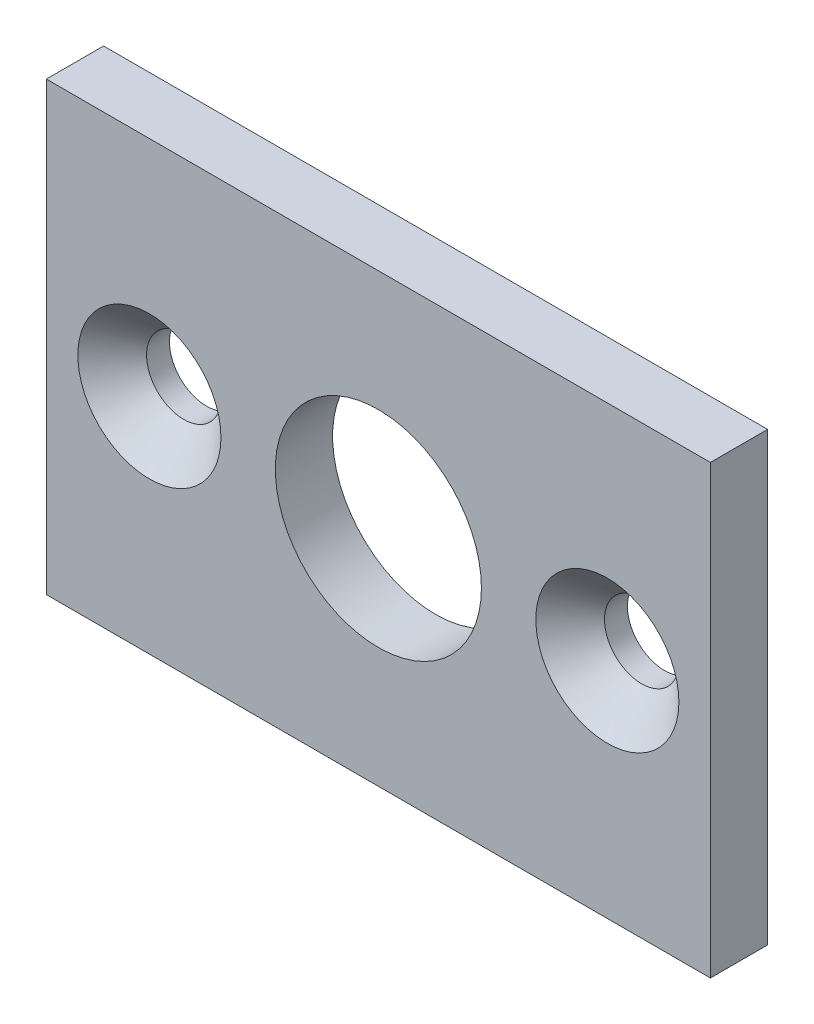
ISO-10303-21;
HEADER;
FILE_DESCRIPTION(('STEP AP214'),'2;1');
FILE_NAME('part.step','',(''),(''),'','','');
FILE_SCHEMA(('AUTOMOTIVE_DESIGN { 1 0 10303 214 1 1 1 1 }'));
ENDSEC;
DATA;
#1=APPLICATION_CONTEXT('core data for automotive mechanical design processes');
#2=APPLICATION_PROTOCOL_DEFINITION('international standard','automotive_design',2000,#1);
#3=PRODUCT_CONTEXT('',#1,'mechanical');
#4=PRODUCT('Part','Part','',(#3));
#5=PRODUCT_RELATED_PRODUCT_CATEGORY('part','',(#4));
#6=PRODUCT_DEFINITION_FORMATION('','',#4);
#7=PRODUCT_DEFINITION_CONTEXT('part definition',#1,'design');
#8=PRODUCT_DEFINITION('design','',#6,#7);
#9=PRODUCT_DEFINITION_SHAPE('','',#8);
#10=(LENGTH_UNIT() NAMED_UNIT(*) SI_UNIT(.MILLI.,.METRE.));
#11=(NAMED_UNIT(*) PLANE_ANGLE_UNIT() SI_UNIT($,.RADIAN.));
#12=(NAMED_UNIT(*) SI_UNIT($,.STERADIAN.) SOLID_ANGLE_UNIT());
#13=UNCERTAINTY_MEASURE_WITH_UNIT(LENGTH_MEASURE(1.E-05),#10,'distance_accuracy_value','');
#14=(GEOMETRIC_REPRESENTATION_CONTEXT(3) GLOBAL_UNCERTAINTY_ASSIGNED_CONTEXT((#13)) GLOBAL_UNIT_ASSIGNED_CONTEXT((#10,
#11,#12)) REPRESENTATION_CONTEXT('',''));
#15=CARTESIAN_POINT('',(0.,0.,0.));
#16=DIRECTION('',(0.,0.,1.));
#17=DIRECTION('',(1.,0.,0.));
#18=AXIS2_PLACEMENT_3D('',#15,#16,#17);
#19=CARTESIAN_POINT('',(0.,0.,5.));
#20=DIRECTION('',(0.,0.,1.));
#21=DIRECTION('',(1.,0.,0.));
#22=AXIS2_PLACEMENT_3D('',#19,#20,#21);
#23=PLANE('',#22);
#24=CARTESIAN_POINT('',(-20.,0.,5.));
#25=DIRECTION('',(0.,0.,1.));
#26=DIRECTION('',(1.,0.,0.));
#27=AXIS2_PLACEMENT_3D('',#24,#25,#26);
#28=CIRCLE('',#27,6.25);
#29=CARTESIAN_POINT('',(-13.75,0.,5.));
#30=VERTEX_POINT('',#29);
#31=EDGE_CURVE('E133',#30,#30,#28,.T.);
#32=ORIENTED_EDGE('',*,*,#31,.F.);
#33=EDGE_LOOP('',(#32));
#34=FACE_BOUND('',#33,.T.);
#35=CARTESIAN_POINT('',(20.,0.,5.));
#36=DIRECTION('',(0.,0.,1.));
#37=DIRECTION('',(1.,0.,0.));
#38=AXIS2_PLACEMENT_3D('',#35,#36,#37);
#39=CIRCLE('',#38,6.25);
#40=CARTESIAN_POINT('',(26.25,0.,5.));
#41=VERTEX_POINT('',#40);
#42=EDGE_CURVE('E124',#41,#41,#39,.T.);
#43=ORIENTED_EDGE('',*,*,#42,.F.);
#44=EDGE_LOOP('',(#43));
#45=FACE_BOUND('',#44,.T.);
#46=DIRECTION('',(0.,1.,0.));
#47=VECTOR('',#46,1.);
#48=CARTESIAN_POINT('',(29.,19.5,5.));
#49=LINE('',#48,#47);
#50=CARTESIAN_POINT('',(29.,-19.5,5.));
#51=VERTEX_POINT('',#50);
#52=CARTESIAN_POINT('',(29.,19.5,5.));
#53=VERTEX_POINT('',#52);
#54=EDGE_CURVE('E86',#51,#53,#49,.T.);
#55=ORIENTED_EDGE('',*,*,#54,.T.);
#56=DIRECTION('',(-1.,0.,0.));
#57=VECTOR('',#56,1.);
#58=CARTESIAN_POINT('',(-29.,19.5,5.));
#59=LINE('',#58,#57);
#60=CARTESIAN_POINT('',(-29.,19.5,5.));
#61=VERTEX_POINT('',#60);
#62=EDGE_CURVE('E81',#53,#61,#59,.T.);
#63=ORIENTED_EDGE('',*,*,#62,.T.);
#64=DIRECTION('',(0.,-1.,0.));
#65=VECTOR('',#64,1.);
#66=CARTESIAN_POINT('',(-29.,19.5,5.));
#67=LINE('',#66,#65);
#68=CARTESIAN_POINT('',(-29.,-19.5,5.));
#69=VERTEX_POINT('',#68);
#70=EDGE_CURVE('E84',#61,#69,#67,.T.);
#71=ORIENTED_EDGE('',*,*,#70,.T.);
#72=DIRECTION('',(1.,0.,0.));
#73=VECTOR('',#72,1.);
#74=CARTESIAN_POINT('',(-29.,-19.5,5.));
#75=LINE('',#74,#73);
#76=EDGE_CURVE('E51',#69,#51,#75,.T.);
#77=ORIENTED_EDGE('',*,*,#76,.T.);
#78=EDGE_LOOP('',(#55,#63,#71,#77));
#79=FACE_BOUND('',#78,.T.);
#80=CARTESIAN_POINT('',(0.,0.,5.));
#81=DIRECTION('',(0.,0.,1.));
#82=DIRECTION('',(1.,0.,0.));
#83=AXIS2_PLACEMENT_3D('',#80,#81,#82);
#84=CIRCLE('',#83,9.);
#85=CARTESIAN_POINT('',(9.00000000000001,0.,5.));
#86=VERTEX_POINT('',#85);
#87=EDGE_CURVE('E101',#86,#86,#84,.T.);
#88=ORIENTED_EDGE('',*,*,#87,.F.);
#89=EDGE_LOOP('',(#88));
#90=FACE_BOUND('',#89,.T.);
#91=ADVANCED_FACE('F34',(#34,#45,#79,#90),#23,.T.);
#92=CARTESIAN_POINT('',(0.,0.,0.));
#93=DIRECTION('',(0.,0.,1.));
#94=DIRECTION('',(1.,0.,0.));
#95=AXIS2_PLACEMENT_3D('',#92,#93,#94);
#96=PLANE('',#95);
#97=CARTESIAN_POINT('',(-20.,0.,0.));
#98=DIRECTION('',(0.,0.,1.));
#99=DIRECTION('',(1.,0.,0.));
#100=AXIS2_PLACEMENT_3D('',#97,#98,#99);
#101=CIRCLE('',#100,3.24999999999999);
#102=CARTESIAN_POINT('',(-16.75,0.,0.));
#103=VERTEX_POINT('',#102);
#104=EDGE_CURVE('E130',#103,#103,#101,.T.);
#105=ORIENTED_EDGE('',*,*,#104,.T.);
#106=EDGE_LOOP('',(#105));
#107=FACE_BOUND('',#106,.T.);
#108=CARTESIAN_POINT('',(20.,0.,0.));
#109=DIRECTION('',(0.,0.,1.));
#110=DIRECTION('',(1.,0.,0.));
#111=AXIS2_PLACEMENT_3D('',#108,#109,#110);
#112=CIRCLE('',#111,3.24999999999999);
#113=CARTESIAN_POINT('',(23.25,0.,0.));
#114=VERTEX_POINT('',#113);
#115=EDGE_CURVE('E116',#114,#114,#112,.T.);
#116=ORIENTED_EDGE('',*,*,#115,.T.);
#117=EDGE_LOOP('',(#116));
#118=FACE_BOUND('',#117,.T.);
#119=DIRECTION('',(0.,1.,0.));
#120=VECTOR('',#119,1.);
#121=CARTESIAN_POINT('',(29.,19.5,0.));
#122=LINE('',#121,#120);
#123=CARTESIAN_POINT('',(29.,-19.5,0.));
#124=VERTEX_POINT('',#123);
#125=CARTESIAN_POINT('',(29.,19.5,0.));
#126=VERTEX_POINT('',#125);
#127=EDGE_CURVE('E98',#124,#126,#122,.T.);
#128=ORIENTED_EDGE('',*,*,#127,.F.);
#129=DIRECTION('',(1.,0.,0.));
#130=VECTOR('',#129,1.);
#131=CARTESIAN_POINT('',(-29.,-19.5,0.));
#132=LINE('',#131,#130);
#133=CARTESIAN_POINT('',(-29.,-19.5,0.));
#134=VERTEX_POINT('',#133);
#135=EDGE_CURVE('E74',#134,#124,#132,.T.);
#136=ORIENTED_EDGE('',*,*,#135,.F.);
#137=DIRECTION('',(0.,-1.,0.));
#138=VECTOR('',#137,1.);
#139=CARTESIAN_POINT('',(-29.,19.5,0.));
#140=LINE('',#139,#138);
#141=CARTESIAN_POINT('',(-29.,19.5,0.));
#142=VERTEX_POINT('',#141);
#143=EDGE_CURVE('E68',#142,#134,#140,.T.);
#144=ORIENTED_EDGE('',*,*,#143,.F.);
#145=DIRECTION('',(-1.,0.,0.));
#146=VECTOR('',#145,1.);
#147=CARTESIAN_POINT('',(-29.,19.5,0.));
#148=LINE('',#147,#146);
#149=EDGE_CURVE('E90',#126,#142,#148,.T.);
#150=ORIENTED_EDGE('',*,*,#149,.F.);
#151=EDGE_LOOP('',(#128,#136,#144,#150));
#152=FACE_BOUND('',#151,.T.);
#153=CARTESIAN_POINT('',(0.,0.,0.));
#154=DIRECTION('',(0.,0.,1.));
#155=DIRECTION('',(1.,0.,0.));
#156=AXIS2_PLACEMENT_3D('',#153,#154,#155);
#157=CIRCLE('',#156,9.);
#158=CARTESIAN_POINT('',(9.00000000000001,0.,0.));
#159=VERTEX_POINT('',#158);
#160=EDGE_CURVE('E113',#159,#159,#157,.T.);
#161=ORIENTED_EDGE('',*,*,#160,.T.);
#162=EDGE_LOOP('',(#161));
#163=FACE_BOUND('',#162,.T.);
#164=ADVANCED_FACE('F109',(#107,#118,#152,#163),#96,.F.);
#165=CARTESIAN_POINT('',(29.,19.5,5.));
#166=DIRECTION('',(-1.,0.,0.));
#167=DIRECTION('',(0.,-1.,0.));
#168=AXIS2_PLACEMENT_3D('',#165,#166,#167);
#169=PLANE('',#168);
#170=ORIENTED_EDGE('',*,*,#127,.T.);
#171=DIRECTION('',(0.,0.,-1.));
#172=VECTOR('',#171,1.);
#173=CARTESIAN_POINT('',(29.,19.5,5.));
#174=LINE('',#173,#172);
#175=EDGE_CURVE('E11',#53,#126,#174,.T.);
#176=ORIENTED_EDGE('',*,*,#175,.F.);
#177=ORIENTED_EDGE('',*,*,#54,.F.);
#178=DIRECTION('',(0.,0.,-1.));
#179=VECTOR('',#178,1.);
#180=CARTESIAN_POINT('',(29.,-19.5,5.));
#181=LINE('',#180,#179);
#182=EDGE_CURVE('E94',#51,#124,#181,.T.);
#183=ORIENTED_EDGE('',*,*,#182,.T.);
#184=EDGE_LOOP('',(#170,#176,#177,#183));
#185=FACE_BOUND('',#184,.T.);
#186=ADVANCED_FACE('F36',(#185),#169,.F.);
#187=CARTESIAN_POINT('',(-29.,19.5,5.));
#188=DIRECTION('',(0.,-1.,0.));
#189=DIRECTION('',(0.,0.,-1.));
#190=AXIS2_PLACEMENT_3D('',#187,#188,#189);
#191=PLANE('',#190);
#192=ORIENTED_EDGE('',*,*,#149,.T.);
#193=DIRECTION('',(0.,0.,-1.));
#194=VECTOR('',#193,1.);
#195=CARTESIAN_POINT('',(-29.,19.5,5.));
#196=LINE('',#195,#194);
#197=EDGE_CURVE('E43',#61,#142,#196,.T.);
#198=ORIENTED_EDGE('',*,*,#197,.F.);
#199=ORIENTED_EDGE('',*,*,#62,.F.);
#200=ORIENTED_EDGE('',*,*,#175,.T.);
#201=EDGE_LOOP('',(#192,#198,#199,#200));
#202=FACE_BOUND('',#201,.T.);
#203=ADVANCED_FACE('F89',(#202),#191,.F.);
#204=CARTESIAN_POINT('',(-29.,19.5,5.));
#205=DIRECTION('',(1.,0.,0.));
#206=DIRECTION('',(0.,1.,0.));
#207=AXIS2_PLACEMENT_3D('',#204,#205,#206);
#208=PLANE('',#207);
#209=ORIENTED_EDGE('',*,*,#143,.T.);
#210=DIRECTION('',(0.,0.,-1.));
#211=VECTOR('',#210,1.);
#212=CARTESIAN_POINT('',(-29.,-19.5,5.));
#213=LINE('',#212,#211);
#214=EDGE_CURVE('E91',#69,#134,#213,.T.);
#215=ORIENTED_EDGE('',*,*,#214,.F.);
#216=ORIENTED_EDGE('',*,*,#70,.F.);
#217=ORIENTED_EDGE('',*,*,#197,.T.);
#218=EDGE_LOOP('',(#209,#215,#216,#217));
#219=FACE_BOUND('',#218,.T.);
#220=ADVANCED_FACE('F92',(#219),#208,.F.);
#221=CARTESIAN_POINT('',(-29.,-19.5,5.));
#222=DIRECTION('',(0.,1.,0.));
#223=DIRECTION('',(0.,0.,1.));
#224=AXIS2_PLACEMENT_3D('',#221,#222,#223);
#225=PLANE('',#224);
#226=ORIENTED_EDGE('',*,*,#135,.T.);
#227=ORIENTED_EDGE('',*,*,#182,.F.);
#228=ORIENTED_EDGE('',*,*,#76,.F.);
#229=ORIENTED_EDGE('',*,*,#214,.T.);
#230=EDGE_LOOP('',(#226,#227,#228,#229));
#231=FACE_BOUND('',#230,.T.);
#232=ADVANCED_FACE('F106',(#231),#225,.F.);
#233=CARTESIAN_POINT('',(0.,0.,5.));
#234=DIRECTION('',(0.,0.,-1.));
#235=DIRECTION('',(-1.,0.,0.));
#236=AXIS2_PLACEMENT_3D('',#233,#234,#235);
#237=CYLINDRICAL_SURFACE('',#236,9.);
#238=ORIENTED_EDGE('',*,*,#87,.T.);
#239=EDGE_LOOP('',(#238));
#240=FACE_BOUND('',#239,.T.);
#241=ORIENTED_EDGE('',*,*,#160,.F.);
#242=EDGE_LOOP('',(#241));
#243=FACE_BOUND('',#242,.T.);
#244=ADVANCED_FACE('F156',(#240,#243),#237,.F.);
#245=CARTESIAN_POINT('',(20.,0.,5.));
#246=DIRECTION('',(0.,0.,1.));
#247=DIRECTION('',(1.,0.,0.));
#248=AXIS2_PLACEMENT_3D('',#245,#246,#247);
#249=CYLINDRICAL_SURFACE('',#248,3.24999999999999);
#250=ORIENTED_EDGE('',*,*,#115,.F.);
#251=EDGE_LOOP('',(#250));
#252=FACE_BOUND('',#251,.T.);
#253=CARTESIAN_POINT('',(20.,0.,2.));
#254=DIRECTION('',(0.,0.,1.));
#255=DIRECTION('',(1.,0.,0.));
#256=AXIS2_PLACEMENT_3D('',#253,#254,#255);
#257=CIRCLE('',#256,3.25);
#258=CARTESIAN_POINT('',(23.25,0.,2.));
#259=VERTEX_POINT('',#258);
#260=EDGE_CURVE('E121',#259,#259,#257,.T.);
#261=ORIENTED_EDGE('',*,*,#260,.T.);
#262=EDGE_LOOP('',(#261));
#263=FACE_BOUND('',#262,.T.);
#264=ADVANCED_FACE('F147',(#252,#263),#249,.F.);
#265=CARTESIAN_POINT('',(20.,0.,5.));
#266=DIRECTION('',(0.,0.,1.));
#267=DIRECTION('',(1.,0.,0.));
#268=AXIS2_PLACEMENT_3D('',#265,#266,#267);
#269=CONICAL_SURFACE('',#268,6.25,0.785398163397448);
#270=ORIENTED_EDGE('',*,*,#260,.F.);
#271=EDGE_LOOP('',(#270));
#272=FACE_BOUND('',#271,.T.);
#273=ORIENTED_EDGE('',*,*,#42,.T.);
#274=EDGE_LOOP('',(#273));
#275=FACE_BOUND('',#274,.T.);
#276=ADVANCED_FACE('F144',(#272,#275),#269,.F.);
#277=CARTESIAN_POINT('',(-20.,0.,5.));
#278=DIRECTION('',(0.,0.,1.));
#279=DIRECTION('',(1.,0.,0.));
#280=AXIS2_PLACEMENT_3D('',#277,#278,#279);
#281=CYLINDRICAL_SURFACE('',#280,3.24999999999999);
#282=ORIENTED_EDGE('',*,*,#104,.F.);
#283=EDGE_LOOP('',(#282));
#284=FACE_BOUND('',#283,.T.);
#285=CARTESIAN_POINT('',(-20.,0.,2.));
#286=DIRECTION('',(0.,0.,1.));
#287=DIRECTION('',(1.,0.,0.));
#288=AXIS2_PLACEMENT_3D('',#285,#286,#287);
#289=CIRCLE('',#288,3.25);
#290=CARTESIAN_POINT('',(-16.75,0.,2.));
#291=VERTEX_POINT('',#290);
#292=EDGE_CURVE('E127',#291,#291,#289,.T.);
#293=ORIENTED_EDGE('',*,*,#292,.T.);
#294=EDGE_LOOP('',(#293));
#295=FACE_BOUND('',#294,.T.);
#296=ADVANCED_FACE('F146',(#284,#295),#281,.F.);
#297=CARTESIAN_POINT('',(-20.,0.,5.));
#298=DIRECTION('',(0.,0.,1.));
#299=DIRECTION('',(1.,0.,0.));
#300=AXIS2_PLACEMENT_3D('',#297,#298,#299);
#301=CONICAL_SURFACE('',#300,6.25,0.785398163397448);
#302=ORIENTED_EDGE('',*,*,#292,.F.);
#303=EDGE_LOOP('',(#302));
#304=FACE_BOUND('',#303,.T.);
#305=ORIENTED_EDGE('',*,*,#31,.T.);
#306=EDGE_LOOP('',(#305));
#307=FACE_BOUND('',#306,.T.);
#308=ADVANCED_FACE('F137',(#304,#307),#301,.F.);
#309=CLOSED_SHELL('',(#91,#164,#186,#203,#220,#232,#244,#264,#276,#296,#308));
#310=MANIFOLD_SOLID_BREP('B2',#309);
#311=ADVANCED_BREP_SHAPE_REPRESENTATION('',(#18,#310),#14);
#312=SHAPE_DEFINITION_REPRESENTATION(#9,#311);
ENDSEC;
END-ISO-10303-21;
